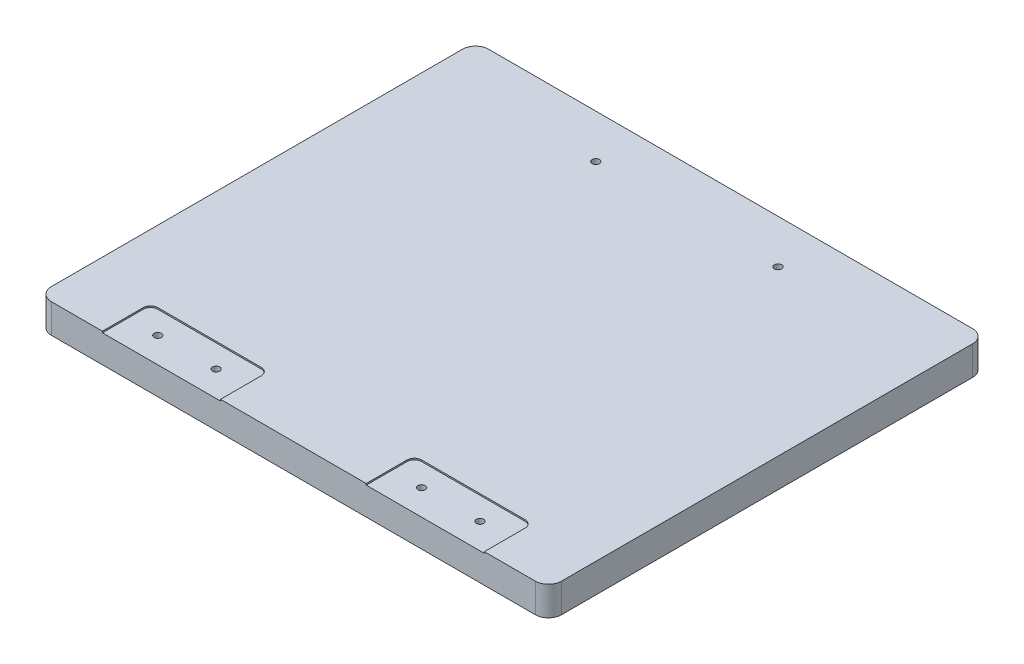
ISO-10303-21;
HEADER;
FILE_DESCRIPTION(('STEP AP214'),'2;1');
FILE_NAME('part.step','',(''),(''),'','','');
FILE_SCHEMA(('AUTOMOTIVE_DESIGN { 1 0 10303 214 1 1 1 1 }'));
ENDSEC;
DATA;
#1=APPLICATION_CONTEXT('core data for automotive mechanical design processes');
#2=APPLICATION_PROTOCOL_DEFINITION('international standard','automotive_design',2000,#1);
#3=PRODUCT_CONTEXT('',#1,'mechanical');
#4=PRODUCT('Part','Part','',(#3));
#5=PRODUCT_RELATED_PRODUCT_CATEGORY('part','',(#4));
#6=PRODUCT_DEFINITION_FORMATION('','',#4);
#7=PRODUCT_DEFINITION_CONTEXT('part definition',#1,'design');
#8=PRODUCT_DEFINITION('design','',#6,#7);
#9=PRODUCT_DEFINITION_SHAPE('','',#8);
#10=(LENGTH_UNIT() NAMED_UNIT(*) SI_UNIT(.MILLI.,.METRE.));
#11=(NAMED_UNIT(*) PLANE_ANGLE_UNIT() SI_UNIT($,.RADIAN.));
#12=(NAMED_UNIT(*) SI_UNIT($,.STERADIAN.) SOLID_ANGLE_UNIT());
#13=UNCERTAINTY_MEASURE_WITH_UNIT(LENGTH_MEASURE(1.E-05),#10,'distance_accuracy_value','');
#14=(GEOMETRIC_REPRESENTATION_CONTEXT(3) GLOBAL_UNCERTAINTY_ASSIGNED_CONTEXT((#13)) GLOBAL_UNIT_ASSIGNED_CONTEXT((#10,
#11,#12)) REPRESENTATION_CONTEXT('',''));
#15=CARTESIAN_POINT('',(0.,0.,0.));
#16=DIRECTION('',(0.,0.,1.));
#17=DIRECTION('',(1.,0.,0.));
#18=AXIS2_PLACEMENT_3D('',#15,#16,#17);
#19=CARTESIAN_POINT('',(175.,20.,-150.));
#20=DIRECTION('',(-1.,0.,0.));
#21=DIRECTION('',(0.,0.,1.));
#22=AXIS2_PLACEMENT_3D('',#19,#20,#21);
#23=PLANE('',#22);
#24=DIRECTION('',(0.,0.,-1.));
#25=VECTOR('',#24,1.);
#26=CARTESIAN_POINT('',(175.,20.,-150.));
#27=LINE('',#26,#25);
#28=CARTESIAN_POINT('',(175.,20.,141.));
#29=VERTEX_POINT('',#28);
#30=CARTESIAN_POINT('',(175.,20.,-141.));
#31=VERTEX_POINT('',#30);
#32=EDGE_CURVE('E388',#29,#31,#27,.T.);
#33=ORIENTED_EDGE('',*,*,#32,.F.);
#34=DIRECTION('',(0.,-1.,0.));
#35=VECTOR('',#34,1.);
#36=CARTESIAN_POINT('',(175.,20.,141.));
#37=LINE('',#36,#35);
#38=CARTESIAN_POINT('',(175.,0.,141.));
#39=VERTEX_POINT('',#38);
#40=EDGE_CURVE('E424',#29,#39,#37,.T.);
#41=ORIENTED_EDGE('',*,*,#40,.T.);
#42=DIRECTION('',(0.,0.,-1.));
#43=VECTOR('',#42,1.);
#44=CARTESIAN_POINT('',(175.,0.,-150.));
#45=LINE('',#44,#43);
#46=CARTESIAN_POINT('',(175.,0.,-141.));
#47=VERTEX_POINT('',#46);
#48=EDGE_CURVE('E315',#39,#47,#45,.T.);
#49=ORIENTED_EDGE('',*,*,#48,.T.);
#50=DIRECTION('',(0.,-1.,0.));
#51=VECTOR('',#50,1.);
#52=CARTESIAN_POINT('',(175.,20.,-141.));
#53=LINE('',#52,#51);
#54=EDGE_CURVE('E406',#47,#31,#53,.F.);
#55=ORIENTED_EDGE('',*,*,#54,.T.);
#56=EDGE_LOOP('',(#33,#41,#49,#55));
#57=FACE_BOUND('',#56,.T.);
#58=ADVANCED_FACE('F55',(#57),#23,.F.);
#59=CARTESIAN_POINT('',(-175.,20.,-150.));
#60=DIRECTION('',(0.,0.,1.));
#61=DIRECTION('',(1.,0.,0.));
#62=AXIS2_PLACEMENT_3D('',#59,#60,#61);
#63=PLANE('',#62);
#64=DIRECTION('',(-1.,0.,0.));
#65=VECTOR('',#64,1.);
#66=CARTESIAN_POINT('',(-175.,0.,-150.));
#67=LINE('',#66,#65);
#68=CARTESIAN_POINT('',(166.,0.,-150.));
#69=VERTEX_POINT('',#68);
#70=CARTESIAN_POINT('',(-166.,0.,-150.));
#71=VERTEX_POINT('',#70);
#72=EDGE_CURVE('E411',#69,#71,#67,.T.);
#73=ORIENTED_EDGE('',*,*,#72,.T.);
#74=DIRECTION('',(0.,-1.,0.));
#75=VECTOR('',#74,1.);
#76=CARTESIAN_POINT('',(-166.,20.,-150.));
#77=LINE('',#76,#75);
#78=CARTESIAN_POINT('',(-166.,20.,-150.));
#79=VERTEX_POINT('',#78);
#80=EDGE_CURVE('E11',#71,#79,#77,.F.);
#81=ORIENTED_EDGE('',*,*,#80,.T.);
#82=DIRECTION('',(-1.,0.,0.));
#83=VECTOR('',#82,1.);
#84=CARTESIAN_POINT('',(-175.,20.,-150.));
#85=LINE('',#84,#83);
#86=CARTESIAN_POINT('',(166.,20.,-150.));
#87=VERTEX_POINT('',#86);
#88=EDGE_CURVE('E392',#87,#79,#85,.T.);
#89=ORIENTED_EDGE('',*,*,#88,.F.);
#90=DIRECTION('',(0.,-1.,0.));
#91=VECTOR('',#90,1.);
#92=CARTESIAN_POINT('',(166.,20.,-150.));
#93=LINE('',#92,#91);
#94=EDGE_CURVE('E64',#87,#69,#93,.T.);
#95=ORIENTED_EDGE('',*,*,#94,.T.);
#96=EDGE_LOOP('',(#73,#81,#89,#95));
#97=FACE_BOUND('',#96,.T.);
#98=ADVANCED_FACE('F472',(#97),#63,.F.);
#99=CARTESIAN_POINT('',(-175.,20.,-150.));
#100=DIRECTION('',(1.,0.,0.));
#101=DIRECTION('',(0.,0.,-1.));
#102=AXIS2_PLACEMENT_3D('',#99,#100,#101);
#103=PLANE('',#102);
#104=DIRECTION('',(0.,0.,1.));
#105=VECTOR('',#104,1.);
#106=CARTESIAN_POINT('',(-175.,20.,-150.));
#107=LINE('',#106,#105);
#108=CARTESIAN_POINT('',(-175.,20.,-141.));
#109=VERTEX_POINT('',#108);
#110=CARTESIAN_POINT('',(-175.,20.,141.));
#111=VERTEX_POINT('',#110);
#112=EDGE_CURVE('E397',#109,#111,#107,.T.);
#113=ORIENTED_EDGE('',*,*,#112,.F.);
#114=DIRECTION('',(0.,-1.,0.));
#115=VECTOR('',#114,1.);
#116=CARTESIAN_POINT('',(-175.,20.,-141.));
#117=LINE('',#116,#115);
#118=CARTESIAN_POINT('',(-175.,0.,-141.));
#119=VERTEX_POINT('',#118);
#120=EDGE_CURVE('E463',#109,#119,#117,.T.);
#121=ORIENTED_EDGE('',*,*,#120,.T.);
#122=DIRECTION('',(0.,0.,1.));
#123=VECTOR('',#122,1.);
#124=CARTESIAN_POINT('',(-175.,0.,-150.));
#125=LINE('',#124,#123);
#126=CARTESIAN_POINT('',(-175.,0.,141.));
#127=VERTEX_POINT('',#126);
#128=EDGE_CURVE('E415',#119,#127,#125,.T.);
#129=ORIENTED_EDGE('',*,*,#128,.T.);
#130=DIRECTION('',(0.,-1.,0.));
#131=VECTOR('',#130,1.);
#132=CARTESIAN_POINT('',(-175.,20.,141.));
#133=LINE('',#132,#131);
#134=EDGE_CURVE('E460',#127,#111,#133,.F.);
#135=ORIENTED_EDGE('',*,*,#134,.T.);
#136=EDGE_LOOP('',(#113,#121,#129,#135));
#137=FACE_BOUND('',#136,.T.);
#138=ADVANCED_FACE('F486',(#137),#103,.F.);
#139=CARTESIAN_POINT('',(-175.,20.,150.));
#140=DIRECTION('',(0.,0.,-1.));
#141=DIRECTION('',(-1.,0.,0.));
#142=AXIS2_PLACEMENT_3D('',#139,#140,#141);
#143=PLANE('',#142);
#144=DIRECTION('',(1.,0.,0.));
#145=VECTOR('',#144,1.);
#146=CARTESIAN_POINT('',(-131.,19.,150.));
#147=LINE('',#146,#145);
#148=CARTESIAN_POINT('',(-131.,19.,150.));
#149=VERTEX_POINT('',#148);
#150=CARTESIAN_POINT('',(-50.,19.,150.));
#151=VERTEX_POINT('',#150);
#152=EDGE_CURVE('E272',#149,#151,#147,.T.);
#153=ORIENTED_EDGE('',*,*,#152,.F.);
#154=DIRECTION('',(0.,1.,0.));
#155=VECTOR('',#154,1.);
#156=CARTESIAN_POINT('',(-131.,19.,150.));
#157=LINE('',#156,#155);
#158=CARTESIAN_POINT('',(-131.,20.,150.));
#159=VERTEX_POINT('',#158);
#160=EDGE_CURVE('E293',#149,#159,#157,.T.);
#161=ORIENTED_EDGE('',*,*,#160,.T.);
#162=DIRECTION('',(1.,0.,0.));
#163=VECTOR('',#162,1.);
#164=CARTESIAN_POINT('',(-175.,20.,150.));
#165=LINE('',#164,#163);
#166=CARTESIAN_POINT('',(-166.,20.,150.));
#167=VERTEX_POINT('',#166);
#168=EDGE_CURVE('E402',#167,#159,#165,.T.);
#169=ORIENTED_EDGE('',*,*,#168,.F.);
#170=DIRECTION('',(0.,-1.,0.));
#171=VECTOR('',#170,1.);
#172=CARTESIAN_POINT('',(-166.,20.,150.));
#173=LINE('',#172,#171);
#174=CARTESIAN_POINT('',(-166.,0.,150.));
#175=VERTEX_POINT('',#174);
#176=EDGE_CURVE('E440',#167,#175,#173,.T.);
#177=ORIENTED_EDGE('',*,*,#176,.T.);
#178=DIRECTION('',(1.,0.,0.));
#179=VECTOR('',#178,1.);
#180=CARTESIAN_POINT('',(-175.,0.,150.));
#181=LINE('',#180,#179);
#182=CARTESIAN_POINT('',(166.,0.,150.));
#183=VERTEX_POINT('',#182);
#184=EDGE_CURVE('E393',#175,#183,#181,.T.);
#185=ORIENTED_EDGE('',*,*,#184,.T.);
#186=DIRECTION('',(0.,-1.,0.));
#187=VECTOR('',#186,1.);
#188=CARTESIAN_POINT('',(166.,20.,150.));
#189=LINE('',#188,#187);
#190=CARTESIAN_POINT('',(166.,20.,150.));
#191=VERTEX_POINT('',#190);
#192=EDGE_CURVE('E444',#183,#191,#189,.F.);
#193=ORIENTED_EDGE('',*,*,#192,.T.);
#194=CARTESIAN_POINT('',(131.,20.,150.));
#195=VERTEX_POINT('',#194);
#196=EDGE_CURVE('E401',#195,#191,#165,.T.);
#197=ORIENTED_EDGE('',*,*,#196,.F.);
#198=DIRECTION('',(0.,1.,0.));
#199=VECTOR('',#198,1.);
#200=CARTESIAN_POINT('',(131.,19.,150.));
#201=LINE('',#200,#199);
#202=CARTESIAN_POINT('',(131.,19.,150.));
#203=VERTEX_POINT('',#202);
#204=EDGE_CURVE('E71',#203,#195,#201,.T.);
#205=ORIENTED_EDGE('',*,*,#204,.F.);
#206=DIRECTION('',(1.,0.,0.));
#207=VECTOR('',#206,1.);
#208=CARTESIAN_POINT('',(50.,19.,150.));
#209=LINE('',#208,#207);
#210=CARTESIAN_POINT('',(50.,19.,150.));
#211=VERTEX_POINT('',#210);
#212=EDGE_CURVE('E381',#211,#203,#209,.T.);
#213=ORIENTED_EDGE('',*,*,#212,.F.);
#214=DIRECTION('',(0.,1.,0.));
#215=VECTOR('',#214,1.);
#216=CARTESIAN_POINT('',(50.,19.,150.));
#217=LINE('',#216,#215);
#218=CARTESIAN_POINT('',(50.,20.,150.));
#219=VERTEX_POINT('',#218);
#220=EDGE_CURVE('E330',#211,#219,#217,.T.);
#221=ORIENTED_EDGE('',*,*,#220,.T.);
#222=CARTESIAN_POINT('',(-50.,20.,150.));
#223=VERTEX_POINT('',#222);
#224=EDGE_CURVE('E407',#223,#219,#165,.T.);
#225=ORIENTED_EDGE('',*,*,#224,.F.);
#226=DIRECTION('',(0.,1.,0.));
#227=VECTOR('',#226,1.);
#228=CARTESIAN_POINT('',(-50.,19.,150.));
#229=LINE('',#228,#227);
#230=EDGE_CURVE('E79',#151,#223,#229,.T.);
#231=ORIENTED_EDGE('',*,*,#230,.F.);
#232=EDGE_LOOP('',(#153,#161,#169,#177,#185,#193,#197,#205,#213,#221,#225,#231));
#233=FACE_BOUND('',#232,.T.);
#234=ADVANCED_FACE('F498',(#233),#143,.F.);
#235=CARTESIAN_POINT('',(0.,20.,0.));
#236=DIRECTION('',(0.,1.,0.));
#237=DIRECTION('',(0.,0.,1.));
#238=AXIS2_PLACEMENT_3D('',#235,#236,#237);
#239=PLANE('',#238);
#240=CARTESIAN_POINT('',(-62.5,20.,-120.));
#241=DIRECTION('',(0.,1.,0.));
#242=DIRECTION('',(0.,0.,1.));
#243=AXIS2_PLACEMENT_3D('',#240,#241,#242);
#244=CIRCLE('',#243,2.49999999999999);
#245=CARTESIAN_POINT('',(-62.5,20.,-117.5));
#246=VERTEX_POINT('',#245);
#247=EDGE_CURVE('E222',#246,#246,#244,.T.);
#248=ORIENTED_EDGE('',*,*,#247,.F.);
#249=EDGE_LOOP('',(#248));
#250=FACE_BOUND('',#249,.T.);
#251=CARTESIAN_POINT('',(62.5,20.,-120.));
#252=DIRECTION('',(0.,1.,0.));
#253=DIRECTION('',(0.,0.,1.));
#254=AXIS2_PLACEMENT_3D('',#251,#252,#253);
#255=CIRCLE('',#254,2.49999999999999);
#256=CARTESIAN_POINT('',(62.5,20.,-117.5));
#257=VERTEX_POINT('',#256);
#258=EDGE_CURVE('E221',#257,#257,#255,.T.);
#259=ORIENTED_EDGE('',*,*,#258,.F.);
#260=EDGE_LOOP('',(#259));
#261=FACE_BOUND('',#260,.T.);
#262=DIRECTION('',(0.,0.,1.));
#263=VECTOR('',#262,1.);
#264=CARTESIAN_POINT('',(-131.,20.,150.));
#265=LINE('',#264,#263);
#266=CARTESIAN_POINT('',(-131.,20.,122.));
#267=VERTEX_POINT('',#266);
#268=EDGE_CURVE('E294',#267,#159,#265,.T.);
#269=ORIENTED_EDGE('',*,*,#268,.F.);
#270=CARTESIAN_POINT('',(-126.,20.,122.));
#271=DIRECTION('',(0.,1.,0.));
#272=DIRECTION('',(0.,0.,-1.));
#273=AXIS2_PLACEMENT_3D('',#270,#271,#272);
#274=CIRCLE('',#273,5.);
#275=CARTESIAN_POINT('',(-126.,20.,117.));
#276=VERTEX_POINT('',#275);
#277=EDGE_CURVE('E273',#276,#267,#274,.T.);
#278=ORIENTED_EDGE('',*,*,#277,.F.);
#279=DIRECTION('',(-1.,0.,0.));
#280=VECTOR('',#279,1.);
#281=CARTESIAN_POINT('',(-126.,20.,117.));
#282=LINE('',#281,#280);
#283=CARTESIAN_POINT('',(-55.,20.,117.));
#284=VERTEX_POINT('',#283);
#285=EDGE_CURVE('E305',#284,#276,#282,.T.);
#286=ORIENTED_EDGE('',*,*,#285,.F.);
#287=CARTESIAN_POINT('',(-55.,20.,122.));
#288=DIRECTION('',(0.,1.,0.));
#289=DIRECTION('',(0.,0.,-1.));
#290=AXIS2_PLACEMENT_3D('',#287,#288,#289);
#291=CIRCLE('',#290,5.);
#292=CARTESIAN_POINT('',(-50.,20.,122.));
#293=VERTEX_POINT('',#292);
#294=EDGE_CURVE('E301',#293,#284,#291,.T.);
#295=ORIENTED_EDGE('',*,*,#294,.F.);
#296=DIRECTION('',(0.,0.,-1.));
#297=VECTOR('',#296,1.);
#298=CARTESIAN_POINT('',(-50.,20.,150.));
#299=LINE('',#298,#297);
#300=EDGE_CURVE('E297',#223,#293,#299,.T.);
#301=ORIENTED_EDGE('',*,*,#300,.F.);
#302=ORIENTED_EDGE('',*,*,#224,.T.);
#303=DIRECTION('',(0.,0.,1.));
#304=VECTOR('',#303,1.);
#305=CARTESIAN_POINT('',(50.,20.,150.));
#306=LINE('',#305,#304);
#307=CARTESIAN_POINT('',(50.,20.,122.));
#308=VERTEX_POINT('',#307);
#309=EDGE_CURVE('E298',#308,#219,#306,.T.);
#310=ORIENTED_EDGE('',*,*,#309,.F.);
#311=CARTESIAN_POINT('',(55.,20.,122.));
#312=DIRECTION('',(0.,1.,0.));
#313=DIRECTION('',(0.,0.,-1.));
#314=AXIS2_PLACEMENT_3D('',#311,#312,#313);
#315=CIRCLE('',#314,5.);
#316=CARTESIAN_POINT('',(55.,20.,117.));
#317=VERTEX_POINT('',#316);
#318=EDGE_CURVE('E348',#317,#308,#315,.T.);
#319=ORIENTED_EDGE('',*,*,#318,.F.);
#320=DIRECTION('',(-1.,0.,0.));
#321=VECTOR('',#320,1.);
#322=CARTESIAN_POINT('',(55.,20.,117.));
#323=LINE('',#322,#321);
#324=CARTESIAN_POINT('',(126.,20.,117.));
#325=VERTEX_POINT('',#324);
#326=EDGE_CURVE('E352',#325,#317,#323,.T.);
#327=ORIENTED_EDGE('',*,*,#326,.F.);
#328=CARTESIAN_POINT('',(126.,20.,122.));
#329=DIRECTION('',(0.,1.,0.));
#330=DIRECTION('',(0.,0.,-1.));
#331=AXIS2_PLACEMENT_3D('',#328,#329,#330);
#332=CIRCLE('',#331,5.);
#333=CARTESIAN_POINT('',(131.,20.,122.));
#334=VERTEX_POINT('',#333);
#335=EDGE_CURVE('E357',#334,#325,#332,.T.);
#336=ORIENTED_EDGE('',*,*,#335,.F.);
#337=DIRECTION('',(0.,0.,-1.));
#338=VECTOR('',#337,1.);
#339=CARTESIAN_POINT('',(131.,20.,150.));
#340=LINE('',#339,#338);
#341=EDGE_CURVE('E361',#195,#334,#340,.T.);
#342=ORIENTED_EDGE('',*,*,#341,.F.);
#343=ORIENTED_EDGE('',*,*,#196,.T.);
#344=CARTESIAN_POINT('',(166.,20.,141.));
#345=DIRECTION('',(0.,1.,0.));
#346=DIRECTION('',(0.,0.,1.));
#347=AXIS2_PLACEMENT_3D('',#344,#345,#346);
#348=CIRCLE('',#347,9.);
#349=EDGE_CURVE('E457',#191,#29,#348,.T.);
#350=ORIENTED_EDGE('',*,*,#349,.T.);
#351=ORIENTED_EDGE('',*,*,#32,.T.);
#352=CARTESIAN_POINT('',(166.,20.,-141.));
#353=DIRECTION('',(0.,1.,0.));
#354=DIRECTION('',(0.,0.,1.));
#355=AXIS2_PLACEMENT_3D('',#352,#353,#354);
#356=CIRCLE('',#355,9.);
#357=EDGE_CURVE('E451',#31,#87,#356,.T.);
#358=ORIENTED_EDGE('',*,*,#357,.T.);
#359=ORIENTED_EDGE('',*,*,#88,.T.);
#360=CARTESIAN_POINT('',(-166.,20.,-141.));
#361=DIRECTION('',(0.,1.,0.));
#362=DIRECTION('',(0.,0.,1.));
#363=AXIS2_PLACEMENT_3D('',#360,#361,#362);
#364=CIRCLE('',#363,9.);
#365=EDGE_CURVE('E454',#79,#109,#364,.T.);
#366=ORIENTED_EDGE('',*,*,#365,.T.);
#367=ORIENTED_EDGE('',*,*,#112,.T.);
#368=CARTESIAN_POINT('',(-166.,20.,141.));
#369=DIRECTION('',(0.,1.,0.));
#370=DIRECTION('',(0.,0.,1.));
#371=AXIS2_PLACEMENT_3D('',#368,#369,#370);
#372=CIRCLE('',#371,9.);
#373=EDGE_CURVE('E448',#111,#167,#372,.T.);
#374=ORIENTED_EDGE('',*,*,#373,.T.);
#375=ORIENTED_EDGE('',*,*,#168,.T.);
#376=EDGE_LOOP('',(#269,#278,#286,#295,#301,#302,#310,#319,#327,#336,#342,#343,#350,#351,#358,
#359,#366,#367,#374,#375));
#377=FACE_BOUND('',#376,.T.);
#378=ADVANCED_FACE('F491',(#250,#261,#377),#239,.T.);
#379=CARTESIAN_POINT('',(0.,0.,0.));
#380=DIRECTION('',(0.,1.,0.));
#381=DIRECTION('',(0.,0.,1.));
#382=AXIS2_PLACEMENT_3D('',#379,#380,#381);
#383=PLANE('',#382);
#384=ORIENTED_EDGE('',*,*,#48,.F.);
#385=CARTESIAN_POINT('',(166.,0.,141.));
#386=DIRECTION('',(0.,1.,0.));
#387=DIRECTION('',(0.,0.,1.));
#388=AXIS2_PLACEMENT_3D('',#385,#386,#387);
#389=CIRCLE('',#388,9.);
#390=EDGE_CURVE('E437',#39,#183,#389,.F.);
#391=ORIENTED_EDGE('',*,*,#390,.T.);
#392=ORIENTED_EDGE('',*,*,#184,.F.);
#393=CARTESIAN_POINT('',(-166.,0.,141.));
#394=DIRECTION('',(0.,1.,0.));
#395=DIRECTION('',(0.,0.,1.));
#396=AXIS2_PLACEMENT_3D('',#393,#394,#395);
#397=CIRCLE('',#396,9.);
#398=EDGE_CURVE('E428',#175,#127,#397,.F.);
#399=ORIENTED_EDGE('',*,*,#398,.T.);
#400=ORIENTED_EDGE('',*,*,#128,.F.);
#401=CARTESIAN_POINT('',(-166.,0.,-141.));
#402=DIRECTION('',(0.,1.,0.));
#403=DIRECTION('',(0.,0.,1.));
#404=AXIS2_PLACEMENT_3D('',#401,#402,#403);
#405=CIRCLE('',#404,9.);
#406=EDGE_CURVE('E434',#119,#71,#405,.F.);
#407=ORIENTED_EDGE('',*,*,#406,.T.);
#408=ORIENTED_EDGE('',*,*,#72,.F.);
#409=CARTESIAN_POINT('',(166.,0.,-141.));
#410=DIRECTION('',(0.,1.,0.));
#411=DIRECTION('',(0.,0.,1.));
#412=AXIS2_PLACEMENT_3D('',#409,#410,#411);
#413=CIRCLE('',#412,9.);
#414=EDGE_CURVE('E431',#69,#47,#413,.F.);
#415=ORIENTED_EDGE('',*,*,#414,.T.);
#416=EDGE_LOOP('',(#384,#391,#392,#399,#400,#407,#408,#415));
#417=FACE_BOUND('',#416,.T.);
#418=ADVANCED_FACE('F478',(#417),#383,.F.);
#419=CARTESIAN_POINT('',(166.,20.,141.));
#420=DIRECTION('',(0.,-1.,0.));
#421=DIRECTION('',(0.,0.,-1.));
#422=AXIS2_PLACEMENT_3D('',#419,#420,#421);
#423=CYLINDRICAL_SURFACE('',#422,9.);
#424=ORIENTED_EDGE('',*,*,#349,.F.);
#425=ORIENTED_EDGE('',*,*,#192,.F.);
#426=ORIENTED_EDGE('',*,*,#390,.F.);
#427=ORIENTED_EDGE('',*,*,#40,.F.);
#428=EDGE_LOOP('',(#424,#425,#426,#427));
#429=FACE_BOUND('',#428,.T.);
#430=ADVANCED_FACE('F503',(#429),#423,.T.);
#431=CARTESIAN_POINT('',(-166.,20.,-141.));
#432=DIRECTION('',(0.,-1.,0.));
#433=DIRECTION('',(0.,0.,-1.));
#434=AXIS2_PLACEMENT_3D('',#431,#432,#433);
#435=CYLINDRICAL_SURFACE('',#434,9.);
#436=ORIENTED_EDGE('',*,*,#365,.F.);
#437=ORIENTED_EDGE('',*,*,#80,.F.);
#438=ORIENTED_EDGE('',*,*,#406,.F.);
#439=ORIENTED_EDGE('',*,*,#120,.F.);
#440=EDGE_LOOP('',(#436,#437,#438,#439));
#441=FACE_BOUND('',#440,.T.);
#442=ADVANCED_FACE('F483',(#441),#435,.T.);
#443=CARTESIAN_POINT('',(166.,20.,-141.));
#444=DIRECTION('',(0.,-1.,0.));
#445=DIRECTION('',(0.,0.,-1.));
#446=AXIS2_PLACEMENT_3D('',#443,#444,#445);
#447=CYLINDRICAL_SURFACE('',#446,9.);
#448=ORIENTED_EDGE('',*,*,#357,.F.);
#449=ORIENTED_EDGE('',*,*,#54,.F.);
#450=ORIENTED_EDGE('',*,*,#414,.F.);
#451=ORIENTED_EDGE('',*,*,#94,.F.);
#452=EDGE_LOOP('',(#448,#449,#450,#451));
#453=FACE_BOUND('',#452,.T.);
#454=ADVANCED_FACE('F507',(#453),#447,.T.);
#455=CARTESIAN_POINT('',(-166.,20.,141.));
#456=DIRECTION('',(0.,-1.,0.));
#457=DIRECTION('',(0.,0.,-1.));
#458=AXIS2_PLACEMENT_3D('',#455,#456,#457);
#459=CYLINDRICAL_SURFACE('',#458,9.);
#460=ORIENTED_EDGE('',*,*,#373,.F.);
#461=ORIENTED_EDGE('',*,*,#134,.F.);
#462=ORIENTED_EDGE('',*,*,#398,.F.);
#463=ORIENTED_EDGE('',*,*,#176,.F.);
#464=EDGE_LOOP('',(#460,#461,#462,#463));
#465=FACE_BOUND('',#464,.T.);
#466=ADVANCED_FACE('F57',(#465),#459,.T.);
#467=CARTESIAN_POINT('',(50.,19.,150.));
#468=DIRECTION('',(-1.,0.,0.));
#469=DIRECTION('',(0.,0.,1.));
#470=AXIS2_PLACEMENT_3D('',#467,#468,#469);
#471=PLANE('',#470);
#472=ORIENTED_EDGE('',*,*,#309,.T.);
#473=ORIENTED_EDGE('',*,*,#220,.F.);
#474=DIRECTION('',(0.,0.,1.));
#475=VECTOR('',#474,1.);
#476=CARTESIAN_POINT('',(50.,19.,150.));
#477=LINE('',#476,#475);
#478=CARTESIAN_POINT('',(50.,19.,122.));
#479=VERTEX_POINT('',#478);
#480=EDGE_CURVE('E353',#479,#211,#477,.T.);
#481=ORIENTED_EDGE('',*,*,#480,.F.);
#482=DIRECTION('',(0.,1.,0.));
#483=VECTOR('',#482,1.);
#484=CARTESIAN_POINT('',(50.,19.,122.));
#485=LINE('',#484,#483);
#486=EDGE_CURVE('E267',#479,#308,#485,.T.);
#487=ORIENTED_EDGE('',*,*,#486,.T.);
#488=EDGE_LOOP('',(#472,#473,#481,#487));
#489=FACE_BOUND('',#488,.T.);
#490=ADVANCED_FACE('F513',(#489),#471,.F.);
#491=CARTESIAN_POINT('',(55.,19.,122.));
#492=DIRECTION('',(0.,1.,0.));
#493=DIRECTION('',(0.,0.,1.));
#494=AXIS2_PLACEMENT_3D('',#491,#492,#493);
#495=CYLINDRICAL_SURFACE('',#494,5.);
#496=ORIENTED_EDGE('',*,*,#318,.T.);
#497=ORIENTED_EDGE('',*,*,#486,.F.);
#498=CARTESIAN_POINT('',(55.,19.,122.));
#499=DIRECTION('',(0.,1.,0.));
#500=DIRECTION('',(0.,0.,-1.));
#501=AXIS2_PLACEMENT_3D('',#498,#499,#500);
#502=CIRCLE('',#501,5.);
#503=CARTESIAN_POINT('',(55.,19.,117.));
#504=VERTEX_POINT('',#503);
#505=EDGE_CURVE('E334',#504,#479,#502,.T.);
#506=ORIENTED_EDGE('',*,*,#505,.F.);
#507=DIRECTION('',(0.,1.,0.));
#508=VECTOR('',#507,1.);
#509=CARTESIAN_POINT('',(55.,19.,117.));
#510=LINE('',#509,#508);
#511=EDGE_CURVE('E343',#504,#317,#510,.T.);
#512=ORIENTED_EDGE('',*,*,#511,.T.);
#513=EDGE_LOOP('',(#496,#497,#506,#512));
#514=FACE_BOUND('',#513,.T.);
#515=ADVANCED_FACE('F591',(#514),#495,.F.);
#516=CARTESIAN_POINT('',(55.,19.,117.));
#517=DIRECTION('',(0.,0.,-1.));
#518=DIRECTION('',(-1.,0.,0.));
#519=AXIS2_PLACEMENT_3D('',#516,#517,#518);
#520=PLANE('',#519);
#521=ORIENTED_EDGE('',*,*,#326,.T.);
#522=ORIENTED_EDGE('',*,*,#511,.F.);
#523=DIRECTION('',(-1.,0.,0.));
#524=VECTOR('',#523,1.);
#525=CARTESIAN_POINT('',(55.,19.,117.));
#526=LINE('',#525,#524);
#527=CARTESIAN_POINT('',(126.,19.,117.));
#528=VERTEX_POINT('',#527);
#529=EDGE_CURVE('E369',#528,#504,#526,.T.);
#530=ORIENTED_EDGE('',*,*,#529,.F.);
#531=DIRECTION('',(0.,1.,0.));
#532=VECTOR('',#531,1.);
#533=CARTESIAN_POINT('',(126.,19.,117.));
#534=LINE('',#533,#532);
#535=EDGE_CURVE('E340',#528,#325,#534,.T.);
#536=ORIENTED_EDGE('',*,*,#535,.T.);
#537=EDGE_LOOP('',(#521,#522,#530,#536));
#538=FACE_BOUND('',#537,.T.);
#539=ADVANCED_FACE('F600',(#538),#520,.F.);
#540=CARTESIAN_POINT('',(126.,19.,122.));
#541=DIRECTION('',(0.,1.,0.));
#542=DIRECTION('',(0.,0.,1.));
#543=AXIS2_PLACEMENT_3D('',#540,#541,#542);
#544=CYLINDRICAL_SURFACE('',#543,5.);
#545=ORIENTED_EDGE('',*,*,#335,.T.);
#546=ORIENTED_EDGE('',*,*,#535,.F.);
#547=CARTESIAN_POINT('',(126.,19.,122.));
#548=DIRECTION('',(0.,1.,0.));
#549=DIRECTION('',(0.,0.,-1.));
#550=AXIS2_PLACEMENT_3D('',#547,#548,#549);
#551=CIRCLE('',#550,5.);
#552=CARTESIAN_POINT('',(131.,19.,122.));
#553=VERTEX_POINT('',#552);
#554=EDGE_CURVE('E373',#553,#528,#551,.T.);
#555=ORIENTED_EDGE('',*,*,#554,.F.);
#556=DIRECTION('',(0.,1.,0.));
#557=VECTOR('',#556,1.);
#558=CARTESIAN_POINT('',(131.,19.,122.));
#559=LINE('',#558,#557);
#560=EDGE_CURVE('E337',#553,#334,#559,.T.);
#561=ORIENTED_EDGE('',*,*,#560,.T.);
#562=EDGE_LOOP('',(#545,#546,#555,#561));
#563=FACE_BOUND('',#562,.T.);
#564=ADVANCED_FACE('F609',(#563),#544,.F.);
#565=CARTESIAN_POINT('',(131.,19.,150.));
#566=DIRECTION('',(1.,0.,0.));
#567=DIRECTION('',(0.,0.,-1.));
#568=AXIS2_PLACEMENT_3D('',#565,#566,#567);
#569=PLANE('',#568);
#570=ORIENTED_EDGE('',*,*,#341,.T.);
#571=ORIENTED_EDGE('',*,*,#560,.F.);
#572=DIRECTION('',(0.,0.,-1.));
#573=VECTOR('',#572,1.);
#574=CARTESIAN_POINT('',(131.,19.,150.));
#575=LINE('',#574,#573);
#576=EDGE_CURVE('E377',#203,#553,#575,.T.);
#577=ORIENTED_EDGE('',*,*,#576,.F.);
#578=ORIENTED_EDGE('',*,*,#204,.T.);
#579=EDGE_LOOP('',(#570,#571,#577,#578));
#580=FACE_BOUND('',#579,.T.);
#581=ADVANCED_FACE('F618',(#580),#569,.F.);
#582=CARTESIAN_POINT('',(55.,19.,122.));
#583=DIRECTION('',(0.,-1.,0.));
#584=DIRECTION('',(0.,0.,-1.));
#585=AXIS2_PLACEMENT_3D('',#582,#583,#584);
#586=PLANE('',#585);
#587=CARTESIAN_POINT('',(70.5,19.,132.5));
#588=DIRECTION('',(0.,1.,0.));
#589=DIRECTION('',(0.,0.,1.));
#590=AXIS2_PLACEMENT_3D('',#587,#588,#589);
#591=CIRCLE('',#590,2.5);
#592=CARTESIAN_POINT('',(70.5,19.,135.));
#593=VERTEX_POINT('',#592);
#594=EDGE_CURVE('E251',#593,#593,#591,.T.);
#595=ORIENTED_EDGE('',*,*,#594,.F.);
#596=EDGE_LOOP('',(#595));
#597=FACE_BOUND('',#596,.T.);
#598=CARTESIAN_POINT('',(110.5,19.,132.5));
#599=DIRECTION('',(0.,1.,0.));
#600=DIRECTION('',(0.,0.,1.));
#601=AXIS2_PLACEMENT_3D('',#598,#599,#600);
#602=CIRCLE('',#601,2.5);
#603=CARTESIAN_POINT('',(110.5,19.,135.));
#604=VERTEX_POINT('',#603);
#605=EDGE_CURVE('E259',#604,#604,#602,.T.);
#606=ORIENTED_EDGE('',*,*,#605,.F.);
#607=EDGE_LOOP('',(#606));
#608=FACE_BOUND('',#607,.T.);
#609=ORIENTED_EDGE('',*,*,#480,.T.);
#610=ORIENTED_EDGE('',*,*,#212,.T.);
#611=ORIENTED_EDGE('',*,*,#576,.T.);
#612=ORIENTED_EDGE('',*,*,#554,.T.);
#613=ORIENTED_EDGE('',*,*,#529,.T.);
#614=ORIENTED_EDGE('',*,*,#505,.T.);
#615=EDGE_LOOP('',(#609,#610,#611,#612,#613,#614));
#616=FACE_BOUND('',#615,.T.);
#617=ADVANCED_FACE('F627',(#597,#608,#616),#586,.F.);
#618=CARTESIAN_POINT('',(-131.,19.,150.));
#619=DIRECTION('',(-1.,0.,0.));
#620=DIRECTION('',(0.,0.,1.));
#621=AXIS2_PLACEMENT_3D('',#618,#619,#620);
#622=PLANE('',#621);
#623=ORIENTED_EDGE('',*,*,#268,.T.);
#624=ORIENTED_EDGE('',*,*,#160,.F.);
#625=DIRECTION('',(0.,0.,1.));
#626=VECTOR('',#625,1.);
#627=CARTESIAN_POINT('',(-131.,19.,150.));
#628=LINE('',#627,#626);
#629=CARTESIAN_POINT('',(-131.,19.,122.));
#630=VERTEX_POINT('',#629);
#631=EDGE_CURVE('E268',#630,#149,#628,.T.);
#632=ORIENTED_EDGE('',*,*,#631,.F.);
#633=DIRECTION('',(0.,1.,0.));
#634=VECTOR('',#633,1.);
#635=CARTESIAN_POINT('',(-131.,19.,122.));
#636=LINE('',#635,#634);
#637=EDGE_CURVE('E312',#630,#267,#636,.T.);
#638=ORIENTED_EDGE('',*,*,#637,.T.);
#639=EDGE_LOOP('',(#623,#624,#632,#638));
#640=FACE_BOUND('',#639,.T.);
#641=ADVANCED_FACE('F635',(#640),#622,.F.);
#642=CARTESIAN_POINT('',(-126.,19.,122.));
#643=DIRECTION('',(0.,1.,0.));
#644=DIRECTION('',(0.,0.,1.));
#645=AXIS2_PLACEMENT_3D('',#642,#643,#644);
#646=CYLINDRICAL_SURFACE('',#645,5.);
#647=ORIENTED_EDGE('',*,*,#277,.T.);
#648=ORIENTED_EDGE('',*,*,#637,.F.);
#649=CARTESIAN_POINT('',(-126.,19.,122.));
#650=DIRECTION('',(0.,1.,0.));
#651=DIRECTION('',(0.,0.,-1.));
#652=AXIS2_PLACEMENT_3D('',#649,#650,#651);
#653=CIRCLE('',#652,5.);
#654=CARTESIAN_POINT('',(-126.,19.,117.));
#655=VERTEX_POINT('',#654);
#656=EDGE_CURVE('E289',#655,#630,#653,.T.);
#657=ORIENTED_EDGE('',*,*,#656,.F.);
#658=DIRECTION('',(0.,1.,0.));
#659=VECTOR('',#658,1.);
#660=CARTESIAN_POINT('',(-126.,19.,117.));
#661=LINE('',#660,#659);
#662=EDGE_CURVE('E316',#655,#276,#661,.T.);
#663=ORIENTED_EDGE('',*,*,#662,.T.);
#664=EDGE_LOOP('',(#647,#648,#657,#663));
#665=FACE_BOUND('',#664,.T.);
#666=ADVANCED_FACE('F644',(#665),#646,.F.);
#667=CARTESIAN_POINT('',(-126.,19.,117.));
#668=DIRECTION('',(0.,0.,-1.));
#669=DIRECTION('',(-1.,0.,0.));
#670=AXIS2_PLACEMENT_3D('',#667,#668,#669);
#671=PLANE('',#670);
#672=ORIENTED_EDGE('',*,*,#285,.T.);
#673=ORIENTED_EDGE('',*,*,#662,.F.);
#674=DIRECTION('',(-1.,0.,0.));
#675=VECTOR('',#674,1.);
#676=CARTESIAN_POINT('',(-126.,19.,117.));
#677=LINE('',#676,#675);
#678=CARTESIAN_POINT('',(-55.,19.,117.));
#679=VERTEX_POINT('',#678);
#680=EDGE_CURVE('E285',#679,#655,#677,.T.);
#681=ORIENTED_EDGE('',*,*,#680,.F.);
#682=DIRECTION('',(0.,1.,0.));
#683=VECTOR('',#682,1.);
#684=CARTESIAN_POINT('',(-55.,19.,117.));
#685=LINE('',#684,#683);
#686=EDGE_CURVE('E319',#679,#284,#685,.T.);
#687=ORIENTED_EDGE('',*,*,#686,.T.);
#688=EDGE_LOOP('',(#672,#673,#681,#687));
#689=FACE_BOUND('',#688,.T.);
#690=ADVANCED_FACE('F653',(#689),#671,.F.);
#691=CARTESIAN_POINT('',(-55.,19.,122.));
#692=DIRECTION('',(0.,1.,0.));
#693=DIRECTION('',(0.,0.,1.));
#694=AXIS2_PLACEMENT_3D('',#691,#692,#693);
#695=CYLINDRICAL_SURFACE('',#694,5.);
#696=ORIENTED_EDGE('',*,*,#294,.T.);
#697=ORIENTED_EDGE('',*,*,#686,.F.);
#698=CARTESIAN_POINT('',(-55.,19.,122.));
#699=DIRECTION('',(0.,1.,0.));
#700=DIRECTION('',(0.,0.,-1.));
#701=AXIS2_PLACEMENT_3D('',#698,#699,#700);
#702=CIRCLE('',#701,5.);
#703=CARTESIAN_POINT('',(-50.,19.,122.));
#704=VERTEX_POINT('',#703);
#705=EDGE_CURVE('E281',#704,#679,#702,.T.);
#706=ORIENTED_EDGE('',*,*,#705,.F.);
#707=DIRECTION('',(0.,1.,0.));
#708=VECTOR('',#707,1.);
#709=CARTESIAN_POINT('',(-50.,19.,122.));
#710=LINE('',#709,#708);
#711=EDGE_CURVE('E322',#704,#293,#710,.T.);
#712=ORIENTED_EDGE('',*,*,#711,.T.);
#713=EDGE_LOOP('',(#696,#697,#706,#712));
#714=FACE_BOUND('',#713,.T.);
#715=ADVANCED_FACE('F662',(#714),#695,.F.);
#716=CARTESIAN_POINT('',(-50.,19.,150.));
#717=DIRECTION('',(1.,0.,0.));
#718=DIRECTION('',(0.,0.,-1.));
#719=AXIS2_PLACEMENT_3D('',#716,#717,#718);
#720=PLANE('',#719);
#721=ORIENTED_EDGE('',*,*,#300,.T.);
#722=ORIENTED_EDGE('',*,*,#711,.F.);
#723=DIRECTION('',(0.,0.,-1.));
#724=VECTOR('',#723,1.);
#725=CARTESIAN_POINT('',(-50.,19.,150.));
#726=LINE('',#725,#724);
#727=EDGE_CURVE('E277',#151,#704,#726,.T.);
#728=ORIENTED_EDGE('',*,*,#727,.F.);
#729=ORIENTED_EDGE('',*,*,#230,.T.);
#730=EDGE_LOOP('',(#721,#722,#728,#729));
#731=FACE_BOUND('',#730,.T.);
#732=ADVANCED_FACE('F671',(#731),#720,.F.);
#733=CARTESIAN_POINT('',(-126.,19.,122.));
#734=DIRECTION('',(0.,-1.,0.));
#735=DIRECTION('',(0.,0.,-1.));
#736=AXIS2_PLACEMENT_3D('',#733,#734,#735);
#737=PLANE('',#736);
#738=CARTESIAN_POINT('',(-110.5,19.,132.5));
#739=DIRECTION('',(0.,1.,0.));
#740=DIRECTION('',(0.,0.,1.));
#741=AXIS2_PLACEMENT_3D('',#738,#739,#740);
#742=CIRCLE('',#741,2.5);
#743=CARTESIAN_POINT('',(-110.5,19.,135.));
#744=VERTEX_POINT('',#743);
#745=EDGE_CURVE('E235',#744,#744,#742,.T.);
#746=ORIENTED_EDGE('',*,*,#745,.F.);
#747=EDGE_LOOP('',(#746));
#748=FACE_BOUND('',#747,.T.);
#749=CARTESIAN_POINT('',(-70.5,19.,132.5));
#750=DIRECTION('',(0.,1.,0.));
#751=DIRECTION('',(0.,0.,1.));
#752=AXIS2_PLACEMENT_3D('',#749,#750,#751);
#753=CIRCLE('',#752,2.5);
#754=CARTESIAN_POINT('',(-70.5,19.,135.));
#755=VERTEX_POINT('',#754);
#756=EDGE_CURVE('E243',#755,#755,#753,.T.);
#757=ORIENTED_EDGE('',*,*,#756,.F.);
#758=EDGE_LOOP('',(#757));
#759=FACE_BOUND('',#758,.T.);
#760=ORIENTED_EDGE('',*,*,#631,.T.);
#761=ORIENTED_EDGE('',*,*,#152,.T.);
#762=ORIENTED_EDGE('',*,*,#727,.T.);
#763=ORIENTED_EDGE('',*,*,#705,.T.);
#764=ORIENTED_EDGE('',*,*,#680,.T.);
#765=ORIENTED_EDGE('',*,*,#656,.T.);
#766=EDGE_LOOP('',(#760,#761,#762,#763,#764,#765));
#767=FACE_BOUND('',#766,.T.);
#768=ADVANCED_FACE('F680',(#748,#759,#767),#737,.F.);
#769=CARTESIAN_POINT('',(110.5,5.,132.5));
#770=DIRECTION('',(0.,1.,0.));
#771=DIRECTION('',(0.,0.,1.));
#772=AXIS2_PLACEMENT_3D('',#769,#770,#771);
#773=CONICAL_SURFACE('',#772,2.5,1.02974425867666);
#774=CARTESIAN_POINT('',(110.5,3.4978484524311,132.5));
#775=VERTEX_POINT('',#774);
#776=VERTEX_LOOP('',#775);
#777=FACE_BOUND('',#776,.T.);
#778=CARTESIAN_POINT('',(110.5,5.,132.5));
#779=DIRECTION('',(0.,1.,0.));
#780=DIRECTION('',(0.,0.,1.));
#781=AXIS2_PLACEMENT_3D('',#778,#779,#780);
#782=CIRCLE('',#781,2.5);
#783=CARTESIAN_POINT('',(110.5,5.,135.));
#784=VERTEX_POINT('',#783);
#785=EDGE_CURVE('E263',#784,#784,#782,.T.);
#786=ORIENTED_EDGE('',*,*,#785,.T.);
#787=EDGE_LOOP('',(#786));
#788=FACE_BOUND('',#787,.T.);
#789=ADVANCED_FACE('F688',(#777,#788),#773,.F.);
#790=CARTESIAN_POINT('',(110.5,19.,132.5));
#791=DIRECTION('',(0.,1.,0.));
#792=DIRECTION('',(0.,0.,1.));
#793=AXIS2_PLACEMENT_3D('',#790,#791,#792);
#794=CYLINDRICAL_SURFACE('',#793,2.5);
#795=ORIENTED_EDGE('',*,*,#785,.F.);
#796=EDGE_LOOP('',(#795));
#797=FACE_BOUND('',#796,.T.);
#798=ORIENTED_EDGE('',*,*,#605,.T.);
#799=EDGE_LOOP('',(#798));
#800=FACE_BOUND('',#799,.T.);
#801=ADVANCED_FACE('F698',(#797,#800),#794,.F.);
#802=CARTESIAN_POINT('',(70.5,5.,132.5));
#803=DIRECTION('',(0.,1.,0.));
#804=DIRECTION('',(0.,0.,1.));
#805=AXIS2_PLACEMENT_3D('',#802,#803,#804);
#806=CONICAL_SURFACE('',#805,2.5,1.02974425867666);
#807=CARTESIAN_POINT('',(70.5,3.4978484524311,132.5));
#808=VERTEX_POINT('',#807);
#809=VERTEX_LOOP('',#808);
#810=FACE_BOUND('',#809,.T.);
#811=CARTESIAN_POINT('',(70.5,5.,132.5));
#812=DIRECTION('',(0.,1.,0.));
#813=DIRECTION('',(0.,0.,1.));
#814=AXIS2_PLACEMENT_3D('',#811,#812,#813);
#815=CIRCLE('',#814,2.5);
#816=CARTESIAN_POINT('',(70.5,5.,135.));
#817=VERTEX_POINT('',#816);
#818=EDGE_CURVE('E255',#817,#817,#815,.T.);
#819=ORIENTED_EDGE('',*,*,#818,.T.);
#820=EDGE_LOOP('',(#819));
#821=FACE_BOUND('',#820,.T.);
#822=ADVANCED_FACE('F707',(#810,#821),#806,.F.);
#823=CARTESIAN_POINT('',(70.5,19.,132.5));
#824=DIRECTION('',(0.,1.,0.));
#825=DIRECTION('',(0.,0.,1.));
#826=AXIS2_PLACEMENT_3D('',#823,#824,#825);
#827=CYLINDRICAL_SURFACE('',#826,2.5);
#828=ORIENTED_EDGE('',*,*,#818,.F.);
#829=EDGE_LOOP('',(#828));
#830=FACE_BOUND('',#829,.T.);
#831=ORIENTED_EDGE('',*,*,#594,.T.);
#832=EDGE_LOOP('',(#831));
#833=FACE_BOUND('',#832,.T.);
#834=ADVANCED_FACE('F717',(#830,#833),#827,.F.);
#835=CARTESIAN_POINT('',(-70.5,5.,132.5));
#836=DIRECTION('',(0.,1.,0.));
#837=DIRECTION('',(0.,0.,1.));
#838=AXIS2_PLACEMENT_3D('',#835,#836,#837);
#839=CONICAL_SURFACE('',#838,2.5,1.02974425867666);
#840=CARTESIAN_POINT('',(-70.5,3.4978484524311,132.5));
#841=VERTEX_POINT('',#840);
#842=VERTEX_LOOP('',#841);
#843=FACE_BOUND('',#842,.T.);
#844=CARTESIAN_POINT('',(-70.5,5.,132.5));
#845=DIRECTION('',(0.,1.,0.));
#846=DIRECTION('',(0.,0.,1.));
#847=AXIS2_PLACEMENT_3D('',#844,#845,#846);
#848=CIRCLE('',#847,2.5);
#849=CARTESIAN_POINT('',(-70.5,5.,135.));
#850=VERTEX_POINT('',#849);
#851=EDGE_CURVE('E247',#850,#850,#848,.T.);
#852=ORIENTED_EDGE('',*,*,#851,.T.);
#853=EDGE_LOOP('',(#852));
#854=FACE_BOUND('',#853,.T.);
#855=ADVANCED_FACE('F726',(#843,#854),#839,.F.);
#856=CARTESIAN_POINT('',(-70.5,19.,132.5));
#857=DIRECTION('',(0.,1.,0.));
#858=DIRECTION('',(0.,0.,1.));
#859=AXIS2_PLACEMENT_3D('',#856,#857,#858);
#860=CYLINDRICAL_SURFACE('',#859,2.5);
#861=ORIENTED_EDGE('',*,*,#851,.F.);
#862=EDGE_LOOP('',(#861));
#863=FACE_BOUND('',#862,.T.);
#864=ORIENTED_EDGE('',*,*,#756,.T.);
#865=EDGE_LOOP('',(#864));
#866=FACE_BOUND('',#865,.T.);
#867=ADVANCED_FACE('F736',(#863,#866),#860,.F.);
#868=CARTESIAN_POINT('',(-110.5,5.,132.5));
#869=DIRECTION('',(0.,1.,0.));
#870=DIRECTION('',(0.,0.,1.));
#871=AXIS2_PLACEMENT_3D('',#868,#869,#870);
#872=CONICAL_SURFACE('',#871,2.5,1.02974425867666);
#873=CARTESIAN_POINT('',(-110.5,3.4978484524311,132.5));
#874=VERTEX_POINT('',#873);
#875=VERTEX_LOOP('',#874);
#876=FACE_BOUND('',#875,.T.);
#877=CARTESIAN_POINT('',(-110.5,5.,132.5));
#878=DIRECTION('',(0.,1.,0.));
#879=DIRECTION('',(0.,0.,1.));
#880=AXIS2_PLACEMENT_3D('',#877,#878,#879);
#881=CIRCLE('',#880,2.5);
#882=CARTESIAN_POINT('',(-110.5,5.,135.));
#883=VERTEX_POINT('',#882);
#884=EDGE_CURVE('E239',#883,#883,#881,.T.);
#885=ORIENTED_EDGE('',*,*,#884,.T.);
#886=EDGE_LOOP('',(#885));
#887=FACE_BOUND('',#886,.T.);
#888=ADVANCED_FACE('F745',(#876,#887),#872,.F.);
#889=CARTESIAN_POINT('',(-110.5,19.,132.5));
#890=DIRECTION('',(0.,1.,0.));
#891=DIRECTION('',(0.,0.,1.));
#892=AXIS2_PLACEMENT_3D('',#889,#890,#891);
#893=CYLINDRICAL_SURFACE('',#892,2.5);
#894=ORIENTED_EDGE('',*,*,#884,.F.);
#895=EDGE_LOOP('',(#894));
#896=FACE_BOUND('',#895,.T.);
#897=ORIENTED_EDGE('',*,*,#745,.T.);
#898=EDGE_LOOP('',(#897));
#899=FACE_BOUND('',#898,.T.);
#900=ADVANCED_FACE('F755',(#896,#899),#893,.F.);
#901=CARTESIAN_POINT('',(62.5,8.,-120.));
#902=DIRECTION('',(0.,1.,0.));
#903=DIRECTION('',(0.,0.,1.));
#904=AXIS2_PLACEMENT_3D('',#901,#902,#903);
#905=CONICAL_SURFACE('',#904,2.5,1.02974425867666);
#906=CARTESIAN_POINT('',(62.5,6.4978484524311,-120.));
#907=VERTEX_POINT('',#906);
#908=VERTEX_LOOP('',#907);
#909=FACE_BOUND('',#908,.T.);
#910=CARTESIAN_POINT('',(62.5,8.,-120.));
#911=DIRECTION('',(0.,1.,0.));
#912=DIRECTION('',(0.,0.,1.));
#913=AXIS2_PLACEMENT_3D('',#910,#911,#912);
#914=CIRCLE('',#913,2.5);
#915=CARTESIAN_POINT('',(62.5,8.,-117.5));
#916=VERTEX_POINT('',#915);
#917=EDGE_CURVE('E227',#916,#916,#914,.T.);
#918=ORIENTED_EDGE('',*,*,#917,.T.);
#919=EDGE_LOOP('',(#918));
#920=FACE_BOUND('',#919,.T.);
#921=ADVANCED_FACE('F764',(#909,#920),#905,.F.);
#922=CARTESIAN_POINT('',(62.5,20.,-120.));
#923=DIRECTION('',(0.,1.,0.));
#924=DIRECTION('',(0.,0.,1.));
#925=AXIS2_PLACEMENT_3D('',#922,#923,#924);
#926=CYLINDRICAL_SURFACE('',#925,2.5);
#927=ORIENTED_EDGE('',*,*,#917,.F.);
#928=EDGE_LOOP('',(#927));
#929=FACE_BOUND('',#928,.T.);
#930=ORIENTED_EDGE('',*,*,#258,.T.);
#931=EDGE_LOOP('',(#930));
#932=FACE_BOUND('',#931,.T.);
#933=ADVANCED_FACE('F214',(#929,#932),#926,.F.);
#934=CARTESIAN_POINT('',(-62.5,8.,-120.));
#935=DIRECTION('',(0.,1.,0.));
#936=DIRECTION('',(0.,0.,1.));
#937=AXIS2_PLACEMENT_3D('',#934,#935,#936);
#938=CONICAL_SURFACE('',#937,2.5,1.02974425867665);
#939=CARTESIAN_POINT('',(-62.5,6.4978484524311,-120.));
#940=VERTEX_POINT('',#939);
#941=VERTEX_LOOP('',#940);
#942=FACE_BOUND('',#941,.T.);
#943=CARTESIAN_POINT('',(-62.5,8.,-120.));
#944=DIRECTION('',(0.,1.,0.));
#945=DIRECTION('',(0.,0.,1.));
#946=AXIS2_PLACEMENT_3D('',#943,#944,#945);
#947=CIRCLE('',#946,2.5);
#948=CARTESIAN_POINT('',(-62.5,8.,-117.5));
#949=VERTEX_POINT('',#948);
#950=EDGE_CURVE('E218',#949,#949,#947,.T.);
#951=ORIENTED_EDGE('',*,*,#950,.T.);
#952=EDGE_LOOP('',(#951));
#953=FACE_BOUND('',#952,.T.);
#954=ADVANCED_FACE('F210',(#942,#953),#938,.F.);
#955=CARTESIAN_POINT('',(-62.5,20.,-120.));
#956=DIRECTION('',(0.,1.,0.));
#957=DIRECTION('',(0.,0.,1.));
#958=AXIS2_PLACEMENT_3D('',#955,#956,#957);
#959=CYLINDRICAL_SURFACE('',#958,2.49999999999999);
#960=ORIENTED_EDGE('',*,*,#950,.F.);
#961=EDGE_LOOP('',(#960));
#962=FACE_BOUND('',#961,.T.);
#963=ORIENTED_EDGE('',*,*,#247,.T.);
#964=EDGE_LOOP('',(#963));
#965=FACE_BOUND('',#964,.T.);
#966=ADVANCED_FACE('F213',(#962,#965),#959,.F.);
#967=CLOSED_SHELL('',(#58,#98,#138,#234,#378,#418,#430,#442,#454,#466,#490,#515,#539,#564,#581,
#617,#641,#666,#690,#715,#732,#768,#789,#801,#822,#834,#855,#867,#888,#900,#921,#933,#954,#966));
#968=MANIFOLD_SOLID_BREP('B2',#967);
#969=ADVANCED_BREP_SHAPE_REPRESENTATION('',(#18,#968),#14);
#970=SHAPE_DEFINITION_REPRESENTATION(#9,#969);
ENDSEC;
END-ISO-10303-21;
